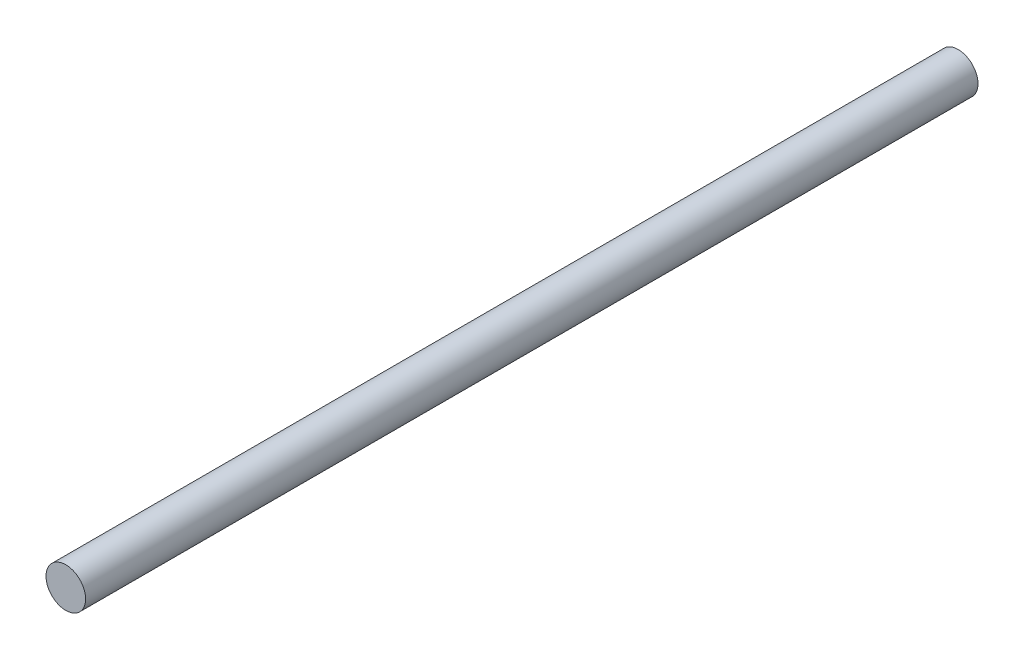
ISO-10303-21;
HEADER;
FILE_DESCRIPTION(('STEP AP214'),'2;1');
FILE_NAME('part.step','',(''),(''),'','','');
FILE_SCHEMA(('AUTOMOTIVE_DESIGN { 1 0 10303 214 1 1 1 1 }'));
ENDSEC;
DATA;
#1=APPLICATION_CONTEXT('core data for automotive mechanical design processes');
#2=APPLICATION_PROTOCOL_DEFINITION('international standard','automotive_design',2000,#1);
#3=PRODUCT_CONTEXT('',#1,'mechanical');
#4=PRODUCT('Part','Part','',(#3));
#5=PRODUCT_RELATED_PRODUCT_CATEGORY('part','',(#4));
#6=PRODUCT_DEFINITION_FORMATION('','',#4);
#7=PRODUCT_DEFINITION_CONTEXT('part definition',#1,'design');
#8=PRODUCT_DEFINITION('design','',#6,#7);
#9=PRODUCT_DEFINITION_SHAPE('','',#8);
#10=(LENGTH_UNIT() NAMED_UNIT(*) SI_UNIT(.MILLI.,.METRE.));
#11=(NAMED_UNIT(*) PLANE_ANGLE_UNIT() SI_UNIT($,.RADIAN.));
#12=(NAMED_UNIT(*) SI_UNIT($,.STERADIAN.) SOLID_ANGLE_UNIT());
#13=UNCERTAINTY_MEASURE_WITH_UNIT(LENGTH_MEASURE(1.E-05),#10,'distance_accuracy_value','');
#14=(GEOMETRIC_REPRESENTATION_CONTEXT(3) GLOBAL_UNCERTAINTY_ASSIGNED_CONTEXT((#13)) GLOBAL_UNIT_ASSIGNED_CONTEXT((#10,
#11,#12)) REPRESENTATION_CONTEXT('',''));
#15=CARTESIAN_POINT('',(0.,0.,0.));
#16=DIRECTION('',(0.,0.,1.));
#17=DIRECTION('',(1.,0.,0.));
#18=AXIS2_PLACEMENT_3D('',#15,#16,#17);
#19=CARTESIAN_POINT('',(0.,0.,49.5630913408264));
#20=DIRECTION('',(0.,0.,1.));
#21=DIRECTION('',(1.,0.,0.));
#22=AXIS2_PLACEMENT_3D('',#19,#20,#21);
#23=PLANE('',#22);
#24=CARTESIAN_POINT('',(0.,0.,49.5630913408264));
#25=DIRECTION('',(0.,0.,-1.));
#26=DIRECTION('',(-1.,0.,0.));
#27=AXIS2_PLACEMENT_3D('',#24,#25,#26);
#28=CIRCLE('',#27,2.2);
#29=CARTESIAN_POINT('',(-2.2,0.,49.5630913408264));
#30=VERTEX_POINT('',#29);
#31=EDGE_CURVE('E9',#30,#30,#28,.T.);
#32=ORIENTED_EDGE('',*,*,#31,.F.);
#33=EDGE_LOOP('',(#32));
#34=FACE_BOUND('',#33,.T.);
#35=ADVANCED_FACE('F14',(#34),#23,.T.);
#36=CARTESIAN_POINT('',(0.,0.,-49.5630913408264));
#37=DIRECTION('',(0.,0.,-1.));
#38=DIRECTION('',(-1.,0.,0.));
#39=AXIS2_PLACEMENT_3D('',#36,#37,#38);
#40=PLANE('',#39);
#41=CARTESIAN_POINT('',(0.,0.,-49.5630913408264));
#42=DIRECTION('',(0.,0.,1.));
#43=DIRECTION('',(1.,0.,0.));
#44=AXIS2_PLACEMENT_3D('',#41,#42,#43);
#45=CIRCLE('',#44,2.2);
#46=CARTESIAN_POINT('',(2.2,0.,-49.5630913408264));
#47=VERTEX_POINT('',#46);
#48=EDGE_CURVE('E21',#47,#47,#45,.T.);
#49=ORIENTED_EDGE('',*,*,#48,.F.);
#50=EDGE_LOOP('',(#49));
#51=FACE_BOUND('',#50,.T.);
#52=ADVANCED_FACE('F29',(#51),#40,.T.);
#53=CARTESIAN_POINT('',(0.,0.,-49.5630913408264));
#54=DIRECTION('',(0.,0.,1.));
#55=DIRECTION('',(1.,0.,0.));
#56=AXIS2_PLACEMENT_3D('',#53,#54,#55);
#57=CYLINDRICAL_SURFACE('',#56,2.2);
#58=ORIENTED_EDGE('',*,*,#31,.T.);
#59=EDGE_LOOP('',(#58));
#60=FACE_BOUND('',#59,.T.);
#61=ORIENTED_EDGE('',*,*,#48,.T.);
#62=EDGE_LOOP('',(#61));
#63=FACE_BOUND('',#62,.T.);
#64=ADVANCED_FACE('F16',(#60,#63),#57,.T.);
#65=CLOSED_SHELL('',(#35,#52,#64));
#66=MANIFOLD_SOLID_BREP('B1',#65);
#67=ADVANCED_BREP_SHAPE_REPRESENTATION('',(#18,#66),#14);
#68=SHAPE_DEFINITION_REPRESENTATION(#9,#67);
ENDSEC;
END-ISO-10303-21;
